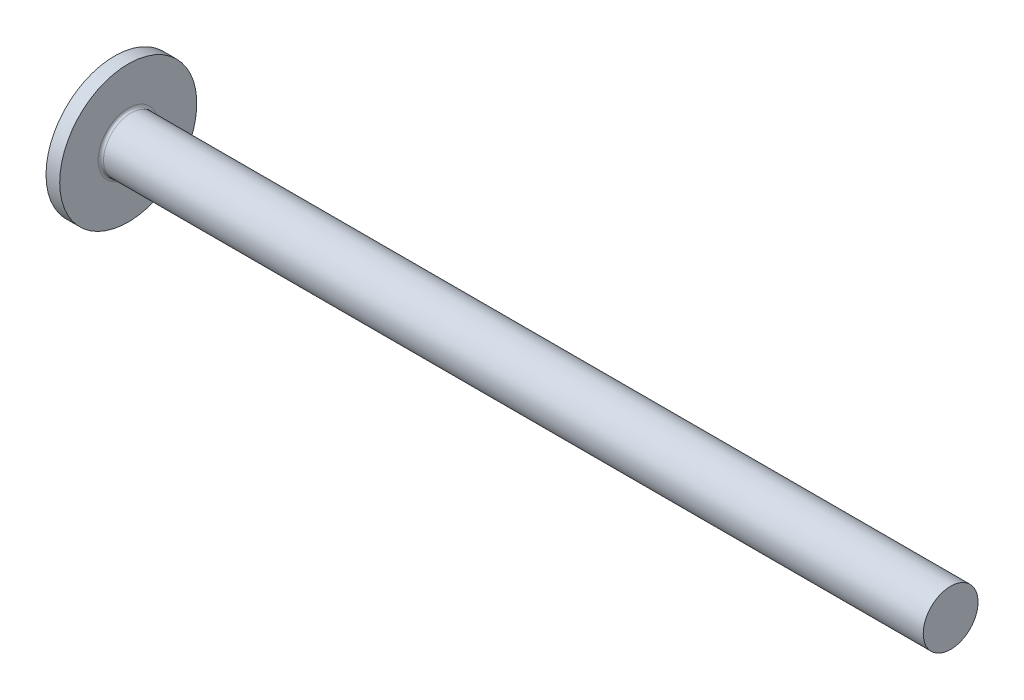
ISO-10303-21;
HEADER;
FILE_DESCRIPTION(('STEP AP214'),'2;1');
FILE_NAME('part.step','',(''),(''),'','','');
FILE_SCHEMA(('AUTOMOTIVE_DESIGN { 1 0 10303 214 1 1 1 1 }'));
ENDSEC;
DATA;
#1=APPLICATION_CONTEXT('core data for automotive mechanical design processes');
#2=APPLICATION_PROTOCOL_DEFINITION('international standard','automotive_design',2000,#1);
#3=PRODUCT_CONTEXT('',#1,'mechanical');
#4=PRODUCT('Part','Part','',(#3));
#5=PRODUCT_RELATED_PRODUCT_CATEGORY('part','',(#4));
#6=PRODUCT_DEFINITION_FORMATION('','',#4);
#7=PRODUCT_DEFINITION_CONTEXT('part definition',#1,'design');
#8=PRODUCT_DEFINITION('design','',#6,#7);
#9=PRODUCT_DEFINITION_SHAPE('','',#8);
#10=(LENGTH_UNIT() NAMED_UNIT(*) SI_UNIT(.MILLI.,.METRE.));
#11=(NAMED_UNIT(*) PLANE_ANGLE_UNIT() SI_UNIT($,.RADIAN.));
#12=(NAMED_UNIT(*) SI_UNIT($,.STERADIAN.) SOLID_ANGLE_UNIT());
#13=UNCERTAINTY_MEASURE_WITH_UNIT(LENGTH_MEASURE(1.E-05),#10,'distance_accuracy_value','');
#14=(GEOMETRIC_REPRESENTATION_CONTEXT(3) GLOBAL_UNCERTAINTY_ASSIGNED_CONTEXT((#13)) GLOBAL_UNIT_ASSIGNED_CONTEXT((#10,
#11,#12)) REPRESENTATION_CONTEXT('',''));
#15=CARTESIAN_POINT('',(0.,0.,0.));
#16=DIRECTION('',(0.,0.,1.));
#17=DIRECTION('',(1.,0.,0.));
#18=AXIS2_PLACEMENT_3D('',#15,#16,#17);
#19=CARTESIAN_POINT('',(0.,-2.15,0.515));
#20=DIRECTION('',(0.,0.,1.));
#21=DIRECTION('',(1.,0.,0.));
#22=AXIS2_PLACEMENT_3D('',#19,#20,#21);
#23=PLANE('',#22);
#24=CARTESIAN_POINT('',(-1.79298661274692,-1.19150572211576,0.515));
#25=CARTESIAN_POINT('',(-1.43619693826883,-1.16432131968278,0.515));
#26=CARTESIAN_POINT('',(-1.07941761560723,-1.13699981932845,0.515));
#27=CARTESIAN_POINT('',(-0.365884361106665,-1.08199408818658,0.515));
#28=CARTESIAN_POINT('',(-0.00913042946924667,-1.05430985478591,0.515));
#29=CARTESIAN_POINT('',(0.704342147946594,-0.99849051732371,0.515));
#30=CARTESIAN_POINT('',(1.06106079373135,-0.970355413343281,0.515));
#31=CARTESIAN_POINT('',(1.77444976866867,-0.913501553756458,0.515));
#32=CARTESIAN_POINT('',(2.13112009806674,-0.88478280123706,0.515));
#33=CARTESIAN_POINT('',(2.86788517328833,-0.824652093056656,0.515));
#34=CARTESIAN_POINT('',(3.24797561760216,-0.7931873300006,0.515));
#35=CARTESIAN_POINT('',(4.00804997853674,-0.729017811285516,0.515));
#36=CARTESIAN_POINT('',(4.38803389587504,-0.696313064191295,0.515));
#37=CARTESIAN_POINT('',(4.95789304042274,-0.645842729737197,0.515));
#38=CARTESIAN_POINT('',(5.14783071731973,-0.628783367168782,0.515));
#39=CARTESIAN_POINT('',(5.52764992575619,-0.594057293430922,0.515));
#40=CARTESIAN_POINT('',(5.71753145749917,-0.576390584490721,0.515));
#41=CARTESIAN_POINT('',(6.09722599136996,-0.540275025810563,0.515));
#42=CARTESIAN_POINT('',(6.28703899147882,-0.521826154666186,0.515));
#43=CARTESIAN_POINT('',(6.66655622713415,-0.483821208979672,0.515));
#44=CARTESIAN_POINT('',(6.85626046127055,-0.464265120397088,0.515));
#45=CARTESIAN_POINT('',(7.04589038802165,-0.443992893773563,0.515));
#46=B_SPLINE_CURVE_WITH_KNOTS('',3,(#24,#25,#26,#27,#28,#29,#30,#31,#32,#33,#34,#35,#36,#37,#38,
#39,#40,#41,#42,#43,#44,#45),.UNSPECIFIED.,.F.,.F.,(4,2,2,2,2,2,2,2,2,2,4),(0.,1.07347147993626,
2.14695069744496,3.22042972187302,4.2939030700023,5.43807363644059,6.58223630131249,
7.15434224418944,7.72644608739511,8.29856559674446,8.87069236267526),.UNSPECIFIED.);
#47=CARTESIAN_POINT('',(2.34,-0.867712978980554,0.515));
#48=VERTEX_POINT('',#47);
#49=CARTESIAN_POINT('',(0.118084953478187,-1.04432581319674,0.515));
#50=VERTEX_POINT('',#49);
#51=EDGE_CURVE('E329',#48,#50,#46,.F.);
#52=ORIENTED_EDGE('',*,*,#51,.F.);
#53=DIRECTION('',(0.,1.,0.));
#54=VECTOR('',#53,1.);
#55=CARTESIAN_POINT('',(2.34,-2.10652468209061,0.515));
#56=LINE('',#55,#54);
#57=CARTESIAN_POINT('',(2.34,-2.10652468209061,0.515));
#58=VERTEX_POINT('',#57);
#59=EDGE_CURVE('E288',#58,#48,#56,.T.);
#60=ORIENTED_EDGE('',*,*,#59,.F.);
#61=DIRECTION('',(0.999827451413597,0.0185759898738224,0.));
#62=VECTOR('',#61,1.);
#63=CARTESIAN_POINT('',(0.,-2.15,0.515));
#64=LINE('',#63,#62);
#65=CARTESIAN_POINT('',(0.434654293272682,-2.14192447282876,0.515));
#66=VERTEX_POINT('',#65);
#67=EDGE_CURVE('E274',#66,#58,#64,.T.);
#68=ORIENTED_EDGE('',*,*,#67,.F.);
#69=CARTESIAN_POINT('',(5.8,0.,0.515));
#70=DIRECTION('',(0.,0.,1.));
#71=DIRECTION('',(1.,0.,0.));
#72=AXIS2_PLACEMENT_3D('',#69,#70,#71);
#73=CIRCLE('',#72,5.77709053070834);
#74=EDGE_CURVE('E211',#50,#66,#73,.T.);
#75=ORIENTED_EDGE('',*,*,#74,.F.);
#76=EDGE_LOOP('',(#52,#60,#68,#75));
#77=FACE_BOUND('',#76,.T.);
#78=ADVANCED_FACE('F36',(#77),#23,.F.);
#79=CARTESIAN_POINT('',(0.,2.15,-0.515));
#80=DIRECTION('',(0.,0.,-1.));
#81=DIRECTION('',(-1.,0.,0.));
#82=AXIS2_PLACEMENT_3D('',#79,#80,#81);
#83=PLANE('',#82);
#84=CARTESIAN_POINT('',(-1.79298661274692,-1.19150572211576,-0.515));
#85=CARTESIAN_POINT('',(-1.43619693826883,-1.16432131968278,-0.515));
#86=CARTESIAN_POINT('',(-1.07941761560723,-1.13699981932845,-0.515));
#87=CARTESIAN_POINT('',(-0.365884361106665,-1.08199408818658,-0.515));
#88=CARTESIAN_POINT('',(-0.00913042946924661,-1.05430985478591,-0.515));
#89=CARTESIAN_POINT('',(0.704342147946594,-0.99849051732371,-0.515));
#90=CARTESIAN_POINT('',(1.06106079373135,-0.970355413343281,-0.515));
#91=CARTESIAN_POINT('',(1.77444976866867,-0.913501553756457,-0.515));
#92=CARTESIAN_POINT('',(2.13112009806674,-0.88478280123706,-0.515));
#93=CARTESIAN_POINT('',(2.86788517328833,-0.824652093056656,-0.515000000000001));
#94=CARTESIAN_POINT('',(3.24797561760216,-0.7931873300006,-0.515000000000001));
#95=CARTESIAN_POINT('',(4.00804997853674,-0.729017811285516,-0.515000000000001));
#96=CARTESIAN_POINT('',(4.38803389587504,-0.696313064191294,-0.515000000000001));
#97=CARTESIAN_POINT('',(4.95789304042275,-0.645842729737197,-0.515000000000001));
#98=CARTESIAN_POINT('',(5.14783071731973,-0.628783367168782,-0.515000000000001));
#99=CARTESIAN_POINT('',(5.52764992575619,-0.594057293430921,-0.515000000000001));
#100=CARTESIAN_POINT('',(5.71753145749917,-0.57639058449072,-0.515000000000001));
#101=CARTESIAN_POINT('',(6.09722599136996,-0.540275025810562,-0.515000000000001));
#102=CARTESIAN_POINT('',(6.28703899147882,-0.521826154666185,-0.515000000000001));
#103=CARTESIAN_POINT('',(6.66655622713415,-0.483821208979671,-0.515000000000001));
#104=CARTESIAN_POINT('',(6.85626046127055,-0.464265120397087,-0.515000000000001));
#105=CARTESIAN_POINT('',(7.04589038802165,-0.443992893773562,-0.515000000000001));
#106=B_SPLINE_CURVE_WITH_KNOTS('',3,(#84,#85,#86,#87,#88,#89,#90,#91,#92,#93,#94,#95,#96,#97,
#98,#99,#100,#101,#102,#103,#104,#105),.UNSPECIFIED.,.F.,.F.,(4,2,2,2,2,2,2,2,2,2,4),(0.,
1.07347147993626,2.14695069744496,3.22042972187302,4.2939030700023,5.43807363644059,
6.58223630131249,7.15434224418944,7.72644608739511,8.29856559674446,8.87069236267526),.UNSPECIFIED.);
#107=CARTESIAN_POINT('',(0.118084953478187,-1.04432581319674,-0.515));
#108=VERTEX_POINT('',#107);
#109=CARTESIAN_POINT('',(2.34,-0.867712978980554,-0.515));
#110=VERTEX_POINT('',#109);
#111=EDGE_CURVE('E321',#108,#110,#106,.T.);
#112=ORIENTED_EDGE('',*,*,#111,.F.);
#113=CARTESIAN_POINT('',(5.8,0.,-0.515000000000001));
#114=DIRECTION('',(0.,0.,-1.));
#115=DIRECTION('',(-1.,0.,0.));
#116=AXIS2_PLACEMENT_3D('',#113,#114,#115);
#117=CIRCLE('',#116,5.77709053070834);
#118=CARTESIAN_POINT('',(0.434654293272682,-2.14192447282876,-0.515));
#119=VERTEX_POINT('',#118);
#120=EDGE_CURVE('E216',#119,#108,#117,.T.);
#121=ORIENTED_EDGE('',*,*,#120,.F.);
#122=DIRECTION('',(0.999827451413597,0.0185759898738224,0.));
#123=VECTOR('',#122,1.);
#124=CARTESIAN_POINT('',(0.,-2.15,-0.515));
#125=LINE('',#124,#123);
#126=CARTESIAN_POINT('',(2.34,-2.10652468209061,-0.515000000000001));
#127=VERTEX_POINT('',#126);
#128=EDGE_CURVE('E277',#119,#127,#125,.T.);
#129=ORIENTED_EDGE('',*,*,#128,.T.);
#130=DIRECTION('',(0.,-1.,0.));
#131=VECTOR('',#130,1.);
#132=CARTESIAN_POINT('',(2.34,2.106524682091,-0.515));
#133=LINE('',#132,#131);
#134=EDGE_CURVE('E287',#110,#127,#133,.T.);
#135=ORIENTED_EDGE('',*,*,#134,.F.);
#136=EDGE_LOOP('',(#112,#121,#129,#135));
#137=FACE_BOUND('',#136,.T.);
#138=ADVANCED_FACE('F169',(#137),#83,.F.);
#139=CARTESIAN_POINT('',(5.8,0.,0.));
#140=DIRECTION('',(-1.,0.,0.));
#141=DIRECTION('',(0.,1.,0.));
#142=AXIS2_PLACEMENT_3D('',#139,#140,#141);
#143=SPHERICAL_SURFACE('',#142,5.8);
#144=CARTESIAN_POINT('',(2.05,0.,0.));
#145=DIRECTION('',(1.,0.,0.));
#146=DIRECTION('',(0.,0.,-1.));
#147=AXIS2_PLACEMENT_3D('',#144,#145,#146);
#148=CIRCLE('',#147,4.42464687856557);
#149=CARTESIAN_POINT('',(2.05,0.,-4.42464687856557));
#150=VERTEX_POINT('',#149);
#151=EDGE_CURVE('E310',#150,#150,#148,.F.);
#152=ORIENTED_EDGE('',*,*,#151,.T.);
#153=EDGE_LOOP('',(#152));
#154=FACE_BOUND('',#153,.T.);
#155=CARTESIAN_POINT('',(0.118084953478187,0.,0.));
#156=DIRECTION('',(1.,0.,0.));
#157=DIRECTION('',(0.,0.,-1.));
#158=AXIS2_PLACEMENT_3D('',#155,#156,#157);
#159=CIRCLE('',#158,1.16440603060489);
#160=CARTESIAN_POINT('',(0.118084953478187,-0.514999999999996,-1.04432581319674));
#161=VERTEX_POINT('',#160);
#162=EDGE_CURVE('E315',#161,#108,#159,.F.);
#163=ORIENTED_EDGE('',*,*,#162,.F.);
#164=CARTESIAN_POINT('',(5.8,-0.515,0.));
#165=DIRECTION('',(0.,-1.,0.));
#166=DIRECTION('',(0.,0.,-1.));
#167=AXIS2_PLACEMENT_3D('',#164,#165,#166);
#168=CIRCLE('',#167,5.77709053070834);
#169=CARTESIAN_POINT('',(0.434654293272682,-0.514999999999992,-2.14192447282876));
#170=VERTEX_POINT('',#169);
#171=EDGE_CURVE('E227',#161,#170,#168,.T.);
#172=ORIENTED_EDGE('',*,*,#171,.T.);
#173=CARTESIAN_POINT('',(5.83793009599922,0.,-2.04153595433488));
#174=DIRECTION('',(0.0185759898738224,0.,-0.999827451413597));
#175=DIRECTION('',(-0.999827451413597,0.,-0.0185759898738224));
#176=AXIS2_PLACEMENT_3D('',#173,#174,#175);
#177=CIRCLE('',#176,5.42869157854593);
#178=CARTESIAN_POINT('',(0.434654293272682,0.515000000000008,-2.14192447282875));
#179=VERTEX_POINT('',#178);
#180=EDGE_CURVE('E50',#170,#179,#177,.T.);
#181=ORIENTED_EDGE('',*,*,#180,.T.);
#182=CARTESIAN_POINT('',(5.8,0.515000000000001,0.));
#183=DIRECTION('',(0.,1.,0.));
#184=DIRECTION('',(0.,0.,1.));
#185=AXIS2_PLACEMENT_3D('',#182,#183,#184);
#186=CIRCLE('',#185,5.77709053070834);
#187=CARTESIAN_POINT('',(0.118084953478187,0.515000000000004,-1.04432581319674));
#188=VERTEX_POINT('',#187);
#189=EDGE_CURVE('E225',#179,#188,#186,.T.);
#190=ORIENTED_EDGE('',*,*,#189,.T.);
#191=CARTESIAN_POINT('',(0.118084953478187,1.04432581319674,-0.515));
#192=VERTEX_POINT('',#191);
#193=EDGE_CURVE('E336',#192,#188,#159,.F.);
#194=ORIENTED_EDGE('',*,*,#193,.F.);
#195=CARTESIAN_POINT('',(0.434654293272711,2.14192447282883,-0.515));
#196=VERTEX_POINT('',#195);
#197=EDGE_CURVE('E312',#192,#196,#117,.T.);
#198=ORIENTED_EDGE('',*,*,#197,.T.);
#199=CARTESIAN_POINT('',(5.83793009599889,2.04153595433587,0.));
#200=DIRECTION('',(0.0185759898736546,0.9998274514136,0.));
#201=DIRECTION('',(-0.9998274514136,0.0185759898736546,0.));
#202=AXIS2_PLACEMENT_3D('',#199,#200,#201);
#203=CIRCLE('',#202,5.42869157854556);
#204=CARTESIAN_POINT('',(0.434654293272711,2.14192447282883,0.515));
#205=VERTEX_POINT('',#204);
#206=EDGE_CURVE('E209',#196,#205,#203,.T.);
#207=ORIENTED_EDGE('',*,*,#206,.T.);
#208=CARTESIAN_POINT('',(0.118084953478187,1.04432581319674,0.515));
#209=VERTEX_POINT('',#208);
#210=EDGE_CURVE('E197',#205,#209,#73,.T.);
#211=ORIENTED_EDGE('',*,*,#210,.T.);
#212=CARTESIAN_POINT('',(0.118084953478187,0.514999999999996,1.04432581319674));
#213=VERTEX_POINT('',#212);
#214=EDGE_CURVE('E207',#213,#209,#159,.F.);
#215=ORIENTED_EDGE('',*,*,#214,.F.);
#216=CARTESIAN_POINT('',(0.434654293272711,0.514999999999992,2.14192447282883));
#217=VERTEX_POINT('',#216);
#218=EDGE_CURVE('E244',#213,#217,#186,.T.);
#219=ORIENTED_EDGE('',*,*,#218,.T.);
#220=CARTESIAN_POINT('',(5.83793009599889,0.,2.04153595433587));
#221=DIRECTION('',(0.0185759898736546,0.,0.9998274514136));
#222=DIRECTION('',(0.9998274514136,0.,-0.0185759898736546));
#223=AXIS2_PLACEMENT_3D('',#220,#221,#222);
#224=CIRCLE('',#223,5.42869157854556);
#225=CARTESIAN_POINT('',(0.434654293272711,-0.515000000000007,2.14192447282883));
#226=VERTEX_POINT('',#225);
#227=EDGE_CURVE('E214',#217,#226,#224,.T.);
#228=ORIENTED_EDGE('',*,*,#227,.T.);
#229=CARTESIAN_POINT('',(0.118084953478187,-0.515000000000004,1.04432581319674));
#230=VERTEX_POINT('',#229);
#231=EDGE_CURVE('E273',#226,#230,#168,.T.);
#232=ORIENTED_EDGE('',*,*,#231,.T.);
#233=EDGE_CURVE('E201',#50,#230,#159,.F.);
#234=ORIENTED_EDGE('',*,*,#233,.F.);
#235=ORIENTED_EDGE('',*,*,#74,.T.);
#236=CARTESIAN_POINT('',(5.83793009599922,-2.04153595433488,0.));
#237=DIRECTION('',(0.0185759898738224,-0.999827451413597,0.));
#238=DIRECTION('',(0.999827451413597,0.0185759898738224,0.));
#239=AXIS2_PLACEMENT_3D('',#236,#237,#238);
#240=CIRCLE('',#239,5.42869157854593);
#241=EDGE_CURVE('E210',#66,#119,#240,.T.);
#242=ORIENTED_EDGE('',*,*,#241,.T.);
#243=ORIENTED_EDGE('',*,*,#120,.T.);
#244=EDGE_LOOP('',(#163,#172,#181,#190,#194,#198,#207,#211,#215,#219,#228,#232,#234,#235,#242,#243));
#245=FACE_BOUND('',#244,.T.);
#246=ADVANCED_FACE('F176',(#154,#245),#143,.T.);
#247=CARTESIAN_POINT('',(-1.79298661274692,1.19150572211576,0.515));
#248=CARTESIAN_POINT('',(-1.43619693826883,1.16432131968278,0.515));
#249=CARTESIAN_POINT('',(-1.07941761560723,1.13699981932845,0.515));
#250=CARTESIAN_POINT('',(-0.365884361106664,1.08199408818658,0.515));
#251=CARTESIAN_POINT('',(-0.0091304294692464,1.05430985478591,0.515));
#252=CARTESIAN_POINT('',(0.704342147946594,0.99849051732371,0.515));
#253=CARTESIAN_POINT('',(1.06106079373135,0.970355413343281,0.515));
#254=CARTESIAN_POINT('',(1.77444976866867,0.913501553756458,0.515));
#255=CARTESIAN_POINT('',(2.13112009806674,0.88478280123706,0.515));
#256=CARTESIAN_POINT('',(2.86788517328833,0.824652093056656,0.515));
#257=CARTESIAN_POINT('',(3.24797561760217,0.7931873300006,0.515));
#258=CARTESIAN_POINT('',(4.00804997853675,0.729017811285516,0.515));
#259=CARTESIAN_POINT('',(4.38803389587504,0.696313064191295,0.515));
#260=CARTESIAN_POINT('',(4.95789304042275,0.645842729737197,0.515));
#261=CARTESIAN_POINT('',(5.14783071731973,0.628783367168782,0.515));
#262=CARTESIAN_POINT('',(5.52764992575619,0.594057293430921,0.515));
#263=CARTESIAN_POINT('',(5.71753145749917,0.57639058449072,0.515));
#264=CARTESIAN_POINT('',(6.09722599136996,0.540275025810563,0.515));
#265=CARTESIAN_POINT('',(6.28703899147882,0.521826154666186,0.515));
#266=CARTESIAN_POINT('',(6.66655622713415,0.483821208979672,0.515));
#267=CARTESIAN_POINT('',(6.85626046127055,0.464265120397087,0.515));
#268=CARTESIAN_POINT('',(7.04589038802165,0.443992893773563,0.515));
#269=B_SPLINE_CURVE_WITH_KNOTS('',3,(#247,#248,#249,#250,#251,#252,#253,#254,#255,#256,#257,
#258,#259,#260,#261,#262,#263,#264,#265,#266,#267,#268),.UNSPECIFIED.,.F.,.F.,(4,2,2,2,2,2,2,2,
2,2,4),(0.,1.07347147993627,2.14695069744496,3.22042972187302,4.2939030700023,5.4380736364406,
6.58223630131249,7.15434224418944,7.72644608739511,8.29856559674446,8.87069236267526),.UNSPECIFIED.);
#270=CARTESIAN_POINT('',(2.34,0.867712978980554,0.515));
#271=VERTEX_POINT('',#270);
#272=EDGE_CURVE('E195',#209,#271,#269,.T.);
#273=ORIENTED_EDGE('',*,*,#272,.F.);
#274=ORIENTED_EDGE('',*,*,#210,.F.);
#275=DIRECTION('',(0.9998274514136,-0.0185759898736546,0.));
#276=VECTOR('',#275,1.);
#277=CARTESIAN_POINT('',(0.,2.15,0.515));
#278=LINE('',#277,#276);
#279=CARTESIAN_POINT('',(2.34,2.106524682091,0.515));
#280=VERTEX_POINT('',#279);
#281=EDGE_CURVE('E64',#205,#280,#278,.T.);
#282=ORIENTED_EDGE('',*,*,#281,.T.);
#283=EDGE_CURVE('E199',#271,#280,#56,.T.);
#284=ORIENTED_EDGE('',*,*,#283,.F.);
#285=EDGE_LOOP('',(#273,#274,#282,#284));
#286=FACE_BOUND('',#285,.T.);
#287=ADVANCED_FACE('F172',(#286),#23,.F.);
#288=CARTESIAN_POINT('',(-1.79298662893649,1.19150572334907,-0.515));
#289=CARTESIAN_POINT('',(-1.43619695230506,1.16432132075639,-0.515));
#290=CARTESIAN_POINT('',(-1.0794176274902,1.13699982024122,-0.515));
#291=CARTESIAN_POINT('',(-0.365884368683318,1.08199408877401,-0.515));
#292=CARTESIAN_POINT('',(-0.00913043489284162,1.05430985520883,-0.515));
#293=CARTESIAN_POINT('',(0.704342147969924,0.99849051732328,-0.515));
#294=CARTESIAN_POINT('',(1.06106079704843,0.970355413082563,-0.515));
#295=CARTESIAN_POINT('',(1.77444977857226,0.913501552963538,-0.515));
#296=CARTESIAN_POINT('',(2.1311201112631,0.884782800172226,-0.515));
#297=CARTESIAN_POINT('',(2.86788518977584,0.824652091698037,-0.515));
#298=CARTESIAN_POINT('',(3.24797563408862,0.793187328627033,-0.515));
#299=CARTESIAN_POINT('',(4.00804999502045,0.729017809875386,-0.515));
#300=CARTESIAN_POINT('',(4.38803391235703,0.69631306275955,-0.515));
#301=CARTESIAN_POINT('',(4.95789305690139,0.645842728263867,-0.515000000000001));
#302=CARTESIAN_POINT('',(5.14783073379719,0.628783365680056,-0.515000000000001));
#303=CARTESIAN_POINT('',(5.52764994223081,0.594057291906936,-0.515000000000001));
#304=CARTESIAN_POINT('',(5.71753147397213,0.576390582946871,-0.515000000000001));
#305=CARTESIAN_POINT('',(6.09722600783899,0.540275024220595,-0.515000000000001));
#306=CARTESIAN_POINT('',(6.28703900794559,0.521826153049963,-0.515000000000001));
#307=CARTESIAN_POINT('',(6.66655624359515,0.483821207299955,-0.515000000000001));
#308=CARTESIAN_POINT('',(6.85626047772805,0.464265118680131,-0.515000000000001));
#309=CARTESIAN_POINT('',(7.0458904044747,0.443992892011579,-0.515000000000001));
#310=B_SPLINE_CURVE_WITH_KNOTS('',3,(#288,#289,#290,#291,#292,#293,#294,#295,#296,#297,#298,
#299,#300,#301,#302,#303,#304,#305,#306,#307,#308,#309),.UNSPECIFIED.,.F.,.F.,(4,2,2,2,2,2,2,2,
2,2,4),(0.,1.07347148641402,2.14695071040071,3.22042974474083,4.29390310278196,5.43807366922081,
6.58223633409312,7.15434227697065,7.72644612017687,8.29856562952703,8.8706923954588),.UNSPECIFIED.);
#311=CARTESIAN_POINT('',(2.34,0.867712978980554,-0.515));
#312=VERTEX_POINT('',#311);
#313=EDGE_CURVE('E347',#312,#192,#310,.F.);
#314=ORIENTED_EDGE('',*,*,#313,.F.);
#315=CARTESIAN_POINT('',(2.34,2.106524682091,-0.515));
#316=VERTEX_POINT('',#315);
#317=EDGE_CURVE('E289',#316,#312,#133,.T.);
#318=ORIENTED_EDGE('',*,*,#317,.F.);
#319=DIRECTION('',(0.9998274514136,-0.0185759898736546,0.));
#320=VECTOR('',#319,1.);
#321=CARTESIAN_POINT('',(0.,2.15,-0.515));
#322=LINE('',#321,#320);
#323=EDGE_CURVE('E281',#196,#316,#322,.T.);
#324=ORIENTED_EDGE('',*,*,#323,.F.);
#325=ORIENTED_EDGE('',*,*,#197,.F.);
#326=EDGE_LOOP('',(#314,#318,#324,#325));
#327=FACE_BOUND('',#326,.T.);
#328=ADVANCED_FACE('F179',(#327),#83,.F.);
#329=CARTESIAN_POINT('',(2.34,2.106524682091,0.515));
#330=DIRECTION('',(-1.,0.,0.));
#331=DIRECTION('',(0.,0.,1.));
#332=AXIS2_PLACEMENT_3D('',#329,#330,#331);
#333=PLANE('',#332);
#334=ORIENTED_EDGE('',*,*,#59,.T.);
#335=CARTESIAN_POINT('',(2.34,0.,0.));
#336=DIRECTION('',(-1.,0.,0.));
#337=DIRECTION('',(0.,0.,1.));
#338=AXIS2_PLACEMENT_3D('',#335,#336,#337);
#339=CIRCLE('',#338,1.00903459499232);
#340=EDGE_CURVE('E333',#48,#110,#339,.F.);
#341=ORIENTED_EDGE('',*,*,#340,.T.);
#342=ORIENTED_EDGE('',*,*,#134,.T.);
#343=DIRECTION('',(0.,0.,1.));
#344=VECTOR('',#343,1.);
#345=CARTESIAN_POINT('',(2.34,-2.10652468209061,-0.515000000000001));
#346=LINE('',#345,#344);
#347=EDGE_CURVE('E283',#127,#58,#346,.T.);
#348=ORIENTED_EDGE('',*,*,#347,.T.);
#349=EDGE_LOOP('',(#334,#341,#342,#348));
#350=FACE_BOUND('',#349,.T.);
#351=ADVANCED_FACE('F189',(#350),#333,.T.);
#352=DIRECTION('',(0.,0.,1.));
#353=VECTOR('',#352,1.);
#354=CARTESIAN_POINT('',(2.34,-0.514999999999993,-2.10652468209061));
#355=LINE('',#354,#353);
#356=CARTESIAN_POINT('',(2.34,-0.514999999999993,-2.10652468209061));
#357=VERTEX_POINT('',#356);
#358=CARTESIAN_POINT('',(2.34,-0.514999999999997,-0.867712978980556));
#359=VERTEX_POINT('',#358);
#360=EDGE_CURVE('E242',#357,#359,#355,.T.);
#361=ORIENTED_EDGE('',*,*,#360,.T.);
#362=CARTESIAN_POINT('',(2.34,0.515000000000004,-0.867712978980552));
#363=VERTEX_POINT('',#362);
#364=EDGE_CURVE('E375',#359,#363,#339,.F.);
#365=ORIENTED_EDGE('',*,*,#364,.T.);
#366=DIRECTION('',(0.,0.,-1.));
#367=VECTOR('',#366,1.);
#368=CARTESIAN_POINT('',(2.34,0.514999999999993,2.106524682091));
#369=LINE('',#368,#367);
#370=CARTESIAN_POINT('',(2.34,0.515000000000008,-2.10652468209061));
#371=VERTEX_POINT('',#370);
#372=EDGE_CURVE('E265',#363,#371,#369,.T.);
#373=ORIENTED_EDGE('',*,*,#372,.T.);
#374=DIRECTION('',(0.,-1.,0.));
#375=VECTOR('',#374,1.);
#376=CARTESIAN_POINT('',(2.34,0.515000000000008,-2.10652468209061));
#377=LINE('',#376,#375);
#378=EDGE_CURVE('E261',#371,#357,#377,.T.);
#379=ORIENTED_EDGE('',*,*,#378,.T.);
#380=EDGE_LOOP('',(#361,#365,#373,#379));
#381=FACE_BOUND('',#380,.T.);
#382=ADVANCED_FACE('F456',(#381),#333,.T.);
#383=ORIENTED_EDGE('',*,*,#317,.T.);
#384=EDGE_CURVE('E331',#312,#271,#339,.F.);
#385=ORIENTED_EDGE('',*,*,#384,.T.);
#386=ORIENTED_EDGE('',*,*,#283,.T.);
#387=DIRECTION('',(0.,0.,-1.));
#388=VECTOR('',#387,1.);
#389=CARTESIAN_POINT('',(2.34,2.106524682091,0.515));
#390=LINE('',#389,#388);
#391=EDGE_CURVE('E284',#280,#316,#390,.T.);
#392=ORIENTED_EDGE('',*,*,#391,.T.);
#393=EDGE_LOOP('',(#383,#385,#386,#392));
#394=FACE_BOUND('',#393,.T.);
#395=ADVANCED_FACE('F380',(#394),#333,.T.);
#396=CARTESIAN_POINT('',(0.,0.514999999999992,2.15));
#397=DIRECTION('',(0.,1.,0.));
#398=DIRECTION('',(-1.,0.,0.));
#399=AXIS2_PLACEMENT_3D('',#396,#397,#398);
#400=PLANE('',#399);
#401=CARTESIAN_POINT('',(-1.79298661274692,0.515000000000004,-1.19150572211576));
#402=CARTESIAN_POINT('',(-1.43619693826883,0.515000000000004,-1.16432131968278));
#403=CARTESIAN_POINT('',(-1.07941761560723,0.515000000000004,-1.13699981932845));
#404=CARTESIAN_POINT('',(-0.365884361106665,0.515000000000004,-1.08199408818658));
#405=CARTESIAN_POINT('',(-0.00913042946924667,0.515000000000004,-1.05430985478591));
#406=CARTESIAN_POINT('',(0.704342147946594,0.515000000000004,-0.998490517323708));
#407=CARTESIAN_POINT('',(1.06106079373135,0.515000000000004,-0.970355413343279));
#408=CARTESIAN_POINT('',(1.77444976866867,0.515000000000004,-0.913501553756456));
#409=CARTESIAN_POINT('',(2.13112009806674,0.515000000000004,-0.884782801237058));
#410=CARTESIAN_POINT('',(2.86788517328833,0.515000000000003,-0.824652093056654));
#411=CARTESIAN_POINT('',(3.24797561760216,0.515000000000003,-0.793187330000598));
#412=CARTESIAN_POINT('',(4.00804997853674,0.515000000000003,-0.729017811285514));
#413=CARTESIAN_POINT('',(4.38803389587504,0.515000000000003,-0.696313064191293));
#414=CARTESIAN_POINT('',(4.95789304042274,0.515000000000003,-0.645842729737195));
#415=CARTESIAN_POINT('',(5.14783071731973,0.515000000000003,-0.62878336716878));
#416=CARTESIAN_POINT('',(5.52764992575619,0.515000000000003,-0.594057293430919));
#417=CARTESIAN_POINT('',(5.71753145749917,0.515000000000003,-0.576390584490718));
#418=CARTESIAN_POINT('',(6.09722599136996,0.515000000000003,-0.540275025810561));
#419=CARTESIAN_POINT('',(6.28703899147882,0.515000000000003,-0.521826154666183));
#420=CARTESIAN_POINT('',(6.66655622713415,0.515000000000003,-0.483821208979669));
#421=CARTESIAN_POINT('',(6.85626046127055,0.515000000000003,-0.464265120397085));
#422=CARTESIAN_POINT('',(7.04589038802165,0.515000000000003,-0.44399289377356));
#423=B_SPLINE_CURVE_WITH_KNOTS('',3,(#401,#402,#403,#404,#405,#406,#407,#408,#409,#410,#411,
#412,#413,#414,#415,#416,#417,#418,#419,#420,#421,#422),.UNSPECIFIED.,.F.,.F.,(4,2,2,2,2,2,2,2,
2,2,4),(0.,1.07347147993626,2.14695069744496,3.22042972187302,4.2939030700023,5.43807363644059,
6.58223630131249,7.15434224418944,7.72644608739511,8.29856559674446,8.87069236267526),.UNSPECIFIED.);
#424=EDGE_CURVE('E370',#188,#363,#423,.T.);
#425=ORIENTED_EDGE('',*,*,#424,.F.);
#426=ORIENTED_EDGE('',*,*,#189,.F.);
#427=DIRECTION('',(0.999827451413597,0.,0.0185759898738224));
#428=VECTOR('',#427,1.);
#429=CARTESIAN_POINT('',(0.,0.515000000000008,-2.15));
#430=LINE('',#429,#428);
#431=EDGE_CURVE('E236',#179,#371,#430,.T.);
#432=ORIENTED_EDGE('',*,*,#431,.T.);
#433=ORIENTED_EDGE('',*,*,#372,.F.);
#434=EDGE_LOOP('',(#425,#426,#432,#433));
#435=FACE_BOUND('',#434,.T.);
#436=ADVANCED_FACE('F376',(#435),#400,.F.);
#437=CARTESIAN_POINT('',(0.,-0.514999999999992,-2.15));
#438=DIRECTION('',(0.,-1.,0.));
#439=DIRECTION('',(1.,0.,0.));
#440=AXIS2_PLACEMENT_3D('',#437,#438,#439);
#441=PLANE('',#440);
#442=CARTESIAN_POINT('',(-1.79298661274692,-0.514999999999996,-1.19150572211576));
#443=CARTESIAN_POINT('',(-1.43619693826883,-0.514999999999996,-1.16432131968278));
#444=CARTESIAN_POINT('',(-1.07941761560723,-0.514999999999996,-1.13699981932845));
#445=CARTESIAN_POINT('',(-0.365884361106665,-0.514999999999996,-1.08199408818658));
#446=CARTESIAN_POINT('',(-0.00913042946924634,-0.514999999999996,-1.05430985478591));
#447=CARTESIAN_POINT('',(0.704342147946594,-0.514999999999996,-0.998490517323712));
#448=CARTESIAN_POINT('',(1.06106079373135,-0.514999999999997,-0.970355413343283));
#449=CARTESIAN_POINT('',(1.77444976866867,-0.514999999999997,-0.91350155375646));
#450=CARTESIAN_POINT('',(2.13112009806674,-0.514999999999997,-0.884782801237062));
#451=CARTESIAN_POINT('',(2.86788517328833,-0.514999999999997,-0.824652093056658));
#452=CARTESIAN_POINT('',(3.24797561760217,-0.514999999999997,-0.793187330000602));
#453=CARTESIAN_POINT('',(4.00804997853675,-0.514999999999998,-0.729017811285517));
#454=CARTESIAN_POINT('',(4.38803389587504,-0.514999999999998,-0.696313064191296));
#455=CARTESIAN_POINT('',(4.95789304042275,-0.514999999999998,-0.645842729737199));
#456=CARTESIAN_POINT('',(5.14783071731973,-0.514999999999998,-0.628783367168784));
#457=CARTESIAN_POINT('',(5.52764992575619,-0.514999999999998,-0.594057293430923));
#458=CARTESIAN_POINT('',(5.71753145749917,-0.514999999999998,-0.576390584490722));
#459=CARTESIAN_POINT('',(6.09722599136996,-0.514999999999998,-0.540275025810564));
#460=CARTESIAN_POINT('',(6.28703899147882,-0.514999999999998,-0.521826154666188));
#461=CARTESIAN_POINT('',(6.66655622713415,-0.514999999999999,-0.483821208979674));
#462=CARTESIAN_POINT('',(6.85626046127055,-0.514999999999999,-0.46426512039709));
#463=CARTESIAN_POINT('',(7.04589038802165,-0.514999999999999,-0.443992893773565));
#464=B_SPLINE_CURVE_WITH_KNOTS('',3,(#442,#443,#444,#445,#446,#447,#448,#449,#450,#451,#452,
#453,#454,#455,#456,#457,#458,#459,#460,#461,#462,#463),.UNSPECIFIED.,.F.,.F.,(4,2,2,2,2,2,2,2,
2,2,4),(0.,1.07347147993626,2.14695069744496,3.22042972187302,4.2939030700023,5.4380736364406,
6.58223630131249,7.15434224418944,7.72644608739511,8.29856559674446,8.87069236267526),.UNSPECIFIED.);
#465=EDGE_CURVE('E249',#359,#161,#464,.F.);
#466=ORIENTED_EDGE('',*,*,#465,.F.);
#467=ORIENTED_EDGE('',*,*,#360,.F.);
#468=DIRECTION('',(0.999827451413597,0.,0.0185759898738224));
#469=VECTOR('',#468,1.);
#470=CARTESIAN_POINT('',(0.,-0.514999999999992,-2.15));
#471=LINE('',#470,#469);
#472=EDGE_CURVE('E233',#170,#357,#471,.T.);
#473=ORIENTED_EDGE('',*,*,#472,.F.);
#474=ORIENTED_EDGE('',*,*,#171,.F.);
#475=EDGE_LOOP('',(#466,#467,#473,#474));
#476=FACE_BOUND('',#475,.T.);
#477=ADVANCED_FACE('F240',(#476),#441,.F.);
#478=CARTESIAN_POINT('',(-1.79298661274692,-0.515000000000004,1.19150572211576));
#479=CARTESIAN_POINT('',(-1.43619693826883,-0.515000000000004,1.16432131968278));
#480=CARTESIAN_POINT('',(-1.07941761560723,-0.515000000000004,1.13699981932845));
#481=CARTESIAN_POINT('',(-0.365884361106665,-0.515000000000004,1.08199408818658));
#482=CARTESIAN_POINT('',(-0.00913042946924661,-0.515000000000004,1.05430985478591));
#483=CARTESIAN_POINT('',(0.704342147946594,-0.515000000000003,0.998490517323709));
#484=CARTESIAN_POINT('',(1.06106079373135,-0.515000000000003,0.970355413343279));
#485=CARTESIAN_POINT('',(1.77444976866867,-0.515000000000003,0.913501553756456));
#486=CARTESIAN_POINT('',(2.13112009806674,-0.515000000000003,0.884782801237058));
#487=CARTESIAN_POINT('',(2.86788517328833,-0.515000000000003,0.824652093056655));
#488=CARTESIAN_POINT('',(3.24797561760216,-0.515000000000003,0.793187330000599));
#489=CARTESIAN_POINT('',(4.00804997853674,-0.515000000000003,0.729017811285514));
#490=CARTESIAN_POINT('',(4.38803389587504,-0.515000000000003,0.696313064191293));
#491=CARTESIAN_POINT('',(4.95789304042274,-0.515000000000002,0.645842729737195));
#492=CARTESIAN_POINT('',(5.14783071731973,-0.515000000000002,0.62878336716878));
#493=CARTESIAN_POINT('',(5.52764992575619,-0.515000000000002,0.59405729343092));
#494=CARTESIAN_POINT('',(5.71753145749917,-0.515000000000002,0.576390584490719));
#495=CARTESIAN_POINT('',(6.09722599136996,-0.515000000000002,0.540275025810561));
#496=CARTESIAN_POINT('',(6.28703899147881,-0.515000000000002,0.521826154666184));
#497=CARTESIAN_POINT('',(6.66655622713415,-0.515000000000002,0.48382120897967));
#498=CARTESIAN_POINT('',(6.85626046127055,-0.515000000000002,0.464265120397086));
#499=CARTESIAN_POINT('',(7.04589038802165,-0.515000000000002,0.443992893773561));
#500=B_SPLINE_CURVE_WITH_KNOTS('',3,(#478,#479,#480,#481,#482,#483,#484,#485,#486,#487,#488,
#489,#490,#491,#492,#493,#494,#495,#496,#497,#498,#499),.UNSPECIFIED.,.F.,.F.,(4,2,2,2,2,2,2,2,
2,2,4),(0.,1.07347147993626,2.14695069744496,3.22042972187302,4.2939030700023,5.43807363644059,
6.58223630131249,7.15434224418944,7.72644608739511,8.29856559674446,8.87069236267526),.UNSPECIFIED.);
#501=CARTESIAN_POINT('',(2.34,-0.515000000000003,0.867712978980552));
#502=VERTEX_POINT('',#501);
#503=EDGE_CURVE('E202',#230,#502,#500,.T.);
#504=ORIENTED_EDGE('',*,*,#503,.F.);
#505=ORIENTED_EDGE('',*,*,#231,.F.);
#506=DIRECTION('',(0.9998274514136,0.,-0.0185759898736546));
#507=VECTOR('',#506,1.);
#508=CARTESIAN_POINT('',(0.,-0.515000000000007,2.15));
#509=LINE('',#508,#507);
#510=CARTESIAN_POINT('',(2.34,-0.515000000000007,2.106524682091));
#511=VERTEX_POINT('',#510);
#512=EDGE_CURVE('E246',#226,#511,#509,.T.);
#513=ORIENTED_EDGE('',*,*,#512,.T.);
#514=EDGE_CURVE('E270',#502,#511,#355,.T.);
#515=ORIENTED_EDGE('',*,*,#514,.F.);
#516=EDGE_LOOP('',(#504,#505,#513,#515));
#517=FACE_BOUND('',#516,.T.);
#518=ADVANCED_FACE('F429',(#517),#441,.F.);
#519=CARTESIAN_POINT('',(-1.79298662893649,0.514999999999995,1.19150572334907));
#520=CARTESIAN_POINT('',(-1.43619695230506,0.514999999999996,1.16432132075639));
#521=CARTESIAN_POINT('',(-1.0794176274902,0.514999999999996,1.13699982024122));
#522=CARTESIAN_POINT('',(-0.365884368683318,0.514999999999996,1.08199408877401));
#523=CARTESIAN_POINT('',(-0.00913043489284162,0.514999999999996,1.05430985520883));
#524=CARTESIAN_POINT('',(0.704342147969924,0.514999999999996,0.998490517323282));
#525=CARTESIAN_POINT('',(1.06106079704843,0.514999999999997,0.970355413082564));
#526=CARTESIAN_POINT('',(1.77444977857226,0.514999999999997,0.913501552963539));
#527=CARTESIAN_POINT('',(2.1311201112631,0.514999999999997,0.884782800172228));
#528=CARTESIAN_POINT('',(2.86788518977584,0.514999999999997,0.824652091698039));
#529=CARTESIAN_POINT('',(3.24797563408862,0.514999999999998,0.793187328627035));
#530=CARTESIAN_POINT('',(4.00804999502045,0.514999999999998,0.729017809875388));
#531=CARTESIAN_POINT('',(4.38803391235703,0.514999999999998,0.696313062759552));
#532=CARTESIAN_POINT('',(4.95789305690139,0.514999999999998,0.645842728263869));
#533=CARTESIAN_POINT('',(5.14783073379719,0.514999999999998,0.628783365680058));
#534=CARTESIAN_POINT('',(5.52764994223081,0.514999999999999,0.594057291906938));
#535=CARTESIAN_POINT('',(5.71753147397213,0.514999999999999,0.576390582946873));
#536=CARTESIAN_POINT('',(6.09722600783899,0.514999999999999,0.540275024220597));
#537=CARTESIAN_POINT('',(6.28703900794559,0.514999999999999,0.521826153049965));
#538=CARTESIAN_POINT('',(6.66655624359515,0.514999999999999,0.483821207299957));
#539=CARTESIAN_POINT('',(6.85626047772805,0.514999999999999,0.464265118680133));
#540=CARTESIAN_POINT('',(7.0458904044747,0.514999999999999,0.443992892011581));
#541=B_SPLINE_CURVE_WITH_KNOTS('',3,(#519,#520,#521,#522,#523,#524,#525,#526,#527,#528,#529,
#530,#531,#532,#533,#534,#535,#536,#537,#538,#539,#540),.UNSPECIFIED.,.F.,.F.,(4,2,2,2,2,2,2,2,
2,2,4),(0.,1.07347148641402,2.14695071040071,3.22042974474083,4.29390310278196,5.43807366922081,
6.58223633409312,7.15434227697065,7.72644612017687,8.29856562952703,8.87069239545879),.UNSPECIFIED.);
#542=CARTESIAN_POINT('',(2.34,0.514999999999997,0.867712978980555));
#543=VERTEX_POINT('',#542);
#544=EDGE_CURVE('E11',#543,#213,#541,.F.);
#545=ORIENTED_EDGE('',*,*,#544,.F.);
#546=CARTESIAN_POINT('',(2.34,0.514999999999993,2.106524682091));
#547=VERTEX_POINT('',#546);
#548=EDGE_CURVE('E266',#547,#543,#369,.T.);
#549=ORIENTED_EDGE('',*,*,#548,.F.);
#550=DIRECTION('',(0.9998274514136,0.,-0.0185759898736546));
#551=VECTOR('',#550,1.);
#552=CARTESIAN_POINT('',(0.,0.514999999999992,2.15));
#553=LINE('',#552,#551);
#554=EDGE_CURVE('E259',#217,#547,#553,.T.);
#555=ORIENTED_EDGE('',*,*,#554,.F.);
#556=ORIENTED_EDGE('',*,*,#218,.F.);
#557=EDGE_LOOP('',(#545,#549,#555,#556));
#558=FACE_BOUND('',#557,.T.);
#559=ADVANCED_FACE('F382',(#558),#400,.F.);
#560=CARTESIAN_POINT('',(-6.34999999999999,0.,0.));
#561=DIRECTION('',(-1.,0.,0.));
#562=DIRECTION('',(0.,0.,1.));
#563=AXIS2_PLACEMENT_3D('',#560,#561,#562);
#564=CYLINDRICAL_SURFACE('',#563,2.00000000000001);
#565=CARTESIAN_POINT('',(3.25,0.,0.));
#566=DIRECTION('',(-1.,0.,0.));
#567=DIRECTION('',(0.,0.,1.));
#568=AXIS2_PLACEMENT_3D('',#565,#566,#567);
#569=CIRCLE('',#568,2.00000000000001);
#570=CARTESIAN_POINT('',(3.25,0.,2.00000000000001));
#571=VERTEX_POINT('',#570);
#572=EDGE_CURVE('E307',#571,#571,#569,.F.);
#573=ORIENTED_EDGE('',*,*,#572,.T.);
#574=EDGE_LOOP('',(#573));
#575=FACE_BOUND('',#574,.T.);
#576=CARTESIAN_POINT('',(63.05,0.,0.));
#577=DIRECTION('',(-1.,0.,0.));
#578=DIRECTION('',(0.,0.,1.));
#579=AXIS2_PLACEMENT_3D('',#576,#577,#578);
#580=CIRCLE('',#579,2.00000000000002);
#581=CARTESIAN_POINT('',(63.05,0.,2.00000000000002));
#582=VERTEX_POINT('',#581);
#583=EDGE_CURVE('E301',#582,#582,#580,.T.);
#584=ORIENTED_EDGE('',*,*,#583,.T.);
#585=EDGE_LOOP('',(#584));
#586=FACE_BOUND('',#585,.T.);
#587=ADVANCED_FACE('F422',(#575,#586),#564,.T.);
#588=CARTESIAN_POINT('',(63.05,2.00000000000002,0.));
#589=DIRECTION('',(1.,0.,0.));
#590=DIRECTION('',(0.,0.,-1.));
#591=AXIS2_PLACEMENT_3D('',#588,#589,#590);
#592=PLANE('',#591);
#593=ORIENTED_EDGE('',*,*,#583,.F.);
#594=EDGE_LOOP('',(#593));
#595=FACE_BOUND('',#594,.T.);
#596=ADVANCED_FACE('F416',(#595),#592,.T.);
#597=CARTESIAN_POINT('',(2.05,5.,0.));
#598=DIRECTION('',(1.,0.,0.));
#599=DIRECTION('',(0.,0.,-1.));
#600=AXIS2_PLACEMENT_3D('',#597,#598,#599);
#601=PLANE('',#600);
#602=ORIENTED_EDGE('',*,*,#151,.F.);
#603=EDGE_LOOP('',(#602));
#604=FACE_BOUND('',#603,.T.);
#605=CARTESIAN_POINT('',(2.05,0.,0.));
#606=DIRECTION('',(-1.,0.,0.));
#607=DIRECTION('',(0.,0.,1.));
#608=AXIS2_PLACEMENT_3D('',#605,#606,#607);
#609=CIRCLE('',#608,5.);
#610=CARTESIAN_POINT('',(2.05,0.,5.));
#611=VERTEX_POINT('',#610);
#612=EDGE_CURVE('E298',#611,#611,#609,.T.);
#613=ORIENTED_EDGE('',*,*,#612,.T.);
#614=EDGE_LOOP('',(#613));
#615=FACE_BOUND('',#614,.T.);
#616=ADVANCED_FACE('F410',(#604,#615),#601,.F.);
#617=CARTESIAN_POINT('',(-6.34999999999999,0.,0.));
#618=DIRECTION('',(-1.,0.,0.));
#619=DIRECTION('',(0.,0.,1.));
#620=AXIS2_PLACEMENT_3D('',#617,#618,#619);
#621=CYLINDRICAL_SURFACE('',#620,5.);
#622=ORIENTED_EDGE('',*,*,#612,.F.);
#623=EDGE_LOOP('',(#622));
#624=FACE_BOUND('',#623,.T.);
#625=CARTESIAN_POINT('',(3.05,0.,0.));
#626=DIRECTION('',(-1.,0.,0.));
#627=DIRECTION('',(0.,0.,1.));
#628=AXIS2_PLACEMENT_3D('',#625,#626,#627);
#629=CIRCLE('',#628,5.);
#630=CARTESIAN_POINT('',(3.05,0.,5.));
#631=VERTEX_POINT('',#630);
#632=EDGE_CURVE('E276',#631,#631,#629,.T.);
#633=ORIENTED_EDGE('',*,*,#632,.T.);
#634=EDGE_LOOP('',(#633));
#635=FACE_BOUND('',#634,.T.);
#636=ADVANCED_FACE('F400',(#624,#635),#621,.T.);
#637=CARTESIAN_POINT('',(3.05,2.,0.));
#638=DIRECTION('',(-1.,0.,0.));
#639=DIRECTION('',(0.,0.,1.));
#640=AXIS2_PLACEMENT_3D('',#637,#638,#639);
#641=PLANE('',#640);
#642=CARTESIAN_POINT('',(3.05,0.,0.));
#643=DIRECTION('',(-1.,0.,0.));
#644=DIRECTION('',(0.,0.,1.));
#645=AXIS2_PLACEMENT_3D('',#642,#643,#644);
#646=CIRCLE('',#645,2.20000000000001);
#647=CARTESIAN_POINT('',(3.05,0.,2.20000000000001));
#648=VERTEX_POINT('',#647);
#649=EDGE_CURVE('E304',#648,#648,#646,.T.);
#650=ORIENTED_EDGE('',*,*,#649,.T.);
#651=EDGE_LOOP('',(#650));
#652=FACE_BOUND('',#651,.T.);
#653=ORIENTED_EDGE('',*,*,#632,.F.);
#654=EDGE_LOOP('',(#653));
#655=FACE_BOUND('',#654,.T.);
#656=ADVANCED_FACE('F395',(#652,#655),#641,.F.);
#657=CARTESIAN_POINT('',(3.25,0.,0.));
#658=DIRECTION('',(-1.,0.,0.));
#659=DIRECTION('',(0.,0.,1.));
#660=AXIS2_PLACEMENT_3D('',#657,#658,#659);
#661=TOROIDAL_SURFACE('',#660,2.20000000000001,0.2);
#662=ORIENTED_EDGE('',*,*,#572,.F.);
#663=EDGE_LOOP('',(#662));
#664=FACE_BOUND('',#663,.T.);
#665=ORIENTED_EDGE('',*,*,#649,.F.);
#666=EDGE_LOOP('',(#665));
#667=FACE_BOUND('',#666,.T.);
#668=ADVANCED_FACE('F38',(#664,#667),#661,.F.);
#669=CARTESIAN_POINT('',(2.34,-2.10652468209061,-0.515000000000001));
#670=DIRECTION('',(0.0185759898738224,-0.999827451413597,0.));
#671=DIRECTION('',(0.999827451413597,0.0185759898738224,0.));
#672=AXIS2_PLACEMENT_3D('',#669,#670,#671);
#673=PLANE('',#672);
#674=ORIENTED_EDGE('',*,*,#67,.T.);
#675=ORIENTED_EDGE('',*,*,#347,.F.);
#676=ORIENTED_EDGE('',*,*,#128,.F.);
#677=ORIENTED_EDGE('',*,*,#241,.F.);
#678=EDGE_LOOP('',(#674,#675,#676,#677));
#679=FACE_BOUND('',#678,.T.);
#680=ADVANCED_FACE('F323',(#679),#673,.F.);
#681=CARTESIAN_POINT('',(2.34,2.106524682091,0.515));
#682=DIRECTION('',(0.0185759898736546,0.9998274514136,0.));
#683=DIRECTION('',(-0.9998274514136,0.0185759898736546,0.));
#684=AXIS2_PLACEMENT_3D('',#681,#682,#683);
#685=PLANE('',#684);
#686=ORIENTED_EDGE('',*,*,#323,.T.);
#687=ORIENTED_EDGE('',*,*,#391,.F.);
#688=ORIENTED_EDGE('',*,*,#281,.F.);
#689=ORIENTED_EDGE('',*,*,#206,.F.);
#690=EDGE_LOOP('',(#686,#687,#688,#689));
#691=FACE_BOUND('',#690,.T.);
#692=ADVANCED_FACE('F388',(#691),#685,.F.);
#693=ORIENTED_EDGE('',*,*,#548,.T.);
#694=EDGE_CURVE('E56',#543,#502,#339,.F.);
#695=ORIENTED_EDGE('',*,*,#694,.T.);
#696=ORIENTED_EDGE('',*,*,#514,.T.);
#697=DIRECTION('',(0.,1.,0.));
#698=VECTOR('',#697,1.);
#699=CARTESIAN_POINT('',(2.34,-0.515000000000007,2.106524682091));
#700=LINE('',#699,#698);
#701=EDGE_CURVE('E262',#511,#547,#700,.T.);
#702=ORIENTED_EDGE('',*,*,#701,.T.);
#703=EDGE_LOOP('',(#693,#695,#696,#702));
#704=FACE_BOUND('',#703,.T.);
#705=ADVANCED_FACE('F393',(#704),#333,.T.);
#706=CARTESIAN_POINT('',(2.34,0.515000000000008,-2.10652468209061));
#707=DIRECTION('',(0.0185759898738224,0.,-0.999827451413597));
#708=DIRECTION('',(0.999827451413597,0.,0.0185759898738224));
#709=AXIS2_PLACEMENT_3D('',#706,#707,#708);
#710=PLANE('',#709);
#711=ORIENTED_EDGE('',*,*,#472,.T.);
#712=ORIENTED_EDGE('',*,*,#378,.F.);
#713=ORIENTED_EDGE('',*,*,#431,.F.);
#714=ORIENTED_EDGE('',*,*,#180,.F.);
#715=EDGE_LOOP('',(#711,#712,#713,#714));
#716=FACE_BOUND('',#715,.T.);
#717=ADVANCED_FACE('F231',(#716),#710,.F.);
#718=CARTESIAN_POINT('',(2.34,-0.515000000000007,2.106524682091));
#719=DIRECTION('',(0.0185759898736546,0.,0.9998274514136));
#720=DIRECTION('',(-0.9998274514136,0.,0.0185759898736546));
#721=AXIS2_PLACEMENT_3D('',#718,#719,#720);
#722=PLANE('',#721);
#723=ORIENTED_EDGE('',*,*,#554,.T.);
#724=ORIENTED_EDGE('',*,*,#701,.F.);
#725=ORIENTED_EDGE('',*,*,#512,.F.);
#726=ORIENTED_EDGE('',*,*,#227,.F.);
#727=EDGE_LOOP('',(#723,#724,#725,#726));
#728=FACE_BOUND('',#727,.T.);
#729=ADVANCED_FACE('F165',(#728),#722,.F.);
#730=CARTESIAN_POINT('',(4.6,0.,0.));
#731=DIRECTION('',(-1.,0.,0.));
#732=DIRECTION('',(0.,0.,1.));
#733=AXIS2_PLACEMENT_3D('',#730,#731,#732);
#734=CONICAL_SURFACE('',#733,0.850999999999999,0.0698131700797659);
#735=CARTESIAN_POINT('',(4.6,0.,0.));
#736=DIRECTION('',(-1.,0.,0.));
#737=DIRECTION('',(0.,0.,1.));
#738=AXIS2_PLACEMENT_3D('',#735,#736,#737);
#739=CIRCLE('',#738,0.850999999999999);
#740=CARTESIAN_POINT('',(4.6,0.,0.850999999999999));
#741=VERTEX_POINT('',#740);
#742=EDGE_CURVE('E454',#741,#741,#739,.T.);
#743=ORIENTED_EDGE('',*,*,#742,.F.);
#744=EDGE_LOOP('',(#743));
#745=FACE_BOUND('',#744,.T.);
#746=ORIENTED_EDGE('',*,*,#465,.T.);
#747=ORIENTED_EDGE('',*,*,#162,.T.);
#748=ORIENTED_EDGE('',*,*,#111,.T.);
#749=ORIENTED_EDGE('',*,*,#340,.F.);
#750=ORIENTED_EDGE('',*,*,#51,.T.);
#751=ORIENTED_EDGE('',*,*,#233,.T.);
#752=ORIENTED_EDGE('',*,*,#503,.T.);
#753=ORIENTED_EDGE('',*,*,#694,.F.);
#754=ORIENTED_EDGE('',*,*,#544,.T.);
#755=ORIENTED_EDGE('',*,*,#214,.T.);
#756=ORIENTED_EDGE('',*,*,#272,.T.);
#757=ORIENTED_EDGE('',*,*,#384,.F.);
#758=ORIENTED_EDGE('',*,*,#313,.T.);
#759=ORIENTED_EDGE('',*,*,#193,.T.);
#760=ORIENTED_EDGE('',*,*,#424,.T.);
#761=ORIENTED_EDGE('',*,*,#364,.F.);
#762=EDGE_LOOP('',(#746,#747,#748,#749,#750,#751,#752,#753,#754,#755,#756,#757,#758,#759,#760,#761));
#763=FACE_BOUND('',#762,.T.);
#764=ADVANCED_FACE('F159',(#745,#763),#734,.F.);
#765=CARTESIAN_POINT('',(4.8765066614942,0.,0.));
#766=DIRECTION('',(-1.,0.,0.));
#767=DIRECTION('',(0.,0.,1.));
#768=AXIS2_PLACEMENT_3D('',#765,#766,#767);
#769=CONICAL_SURFACE('',#768,0.,1.25663706143592);
#770=ORIENTED_EDGE('',*,*,#742,.T.);
#771=EDGE_LOOP('',(#770));
#772=FACE_BOUND('',#771,.T.);
#773=CARTESIAN_POINT('',(4.8765066614942,0.,0.));
#774=VERTEX_POINT('',#773);
#775=VERTEX_LOOP('',#774);
#776=FACE_BOUND('',#775,.T.);
#777=ADVANCED_FACE('F157',(#772,#776),#769,.F.);
#778=CLOSED_SHELL('',(#78,#138,#246,#287,#328,#351,#382,#395,#436,#477,#518,#559,#587,#596,#616,
#636,#656,#668,#680,#692,#705,#717,#729,#764,#777));
#779=MANIFOLD_SOLID_BREP('B2',#778);
#780=ADVANCED_BREP_SHAPE_REPRESENTATION('',(#18,#779),#14);
#781=SHAPE_DEFINITION_REPRESENTATION(#9,#780);
ENDSEC;
END-ISO-10303-21;
